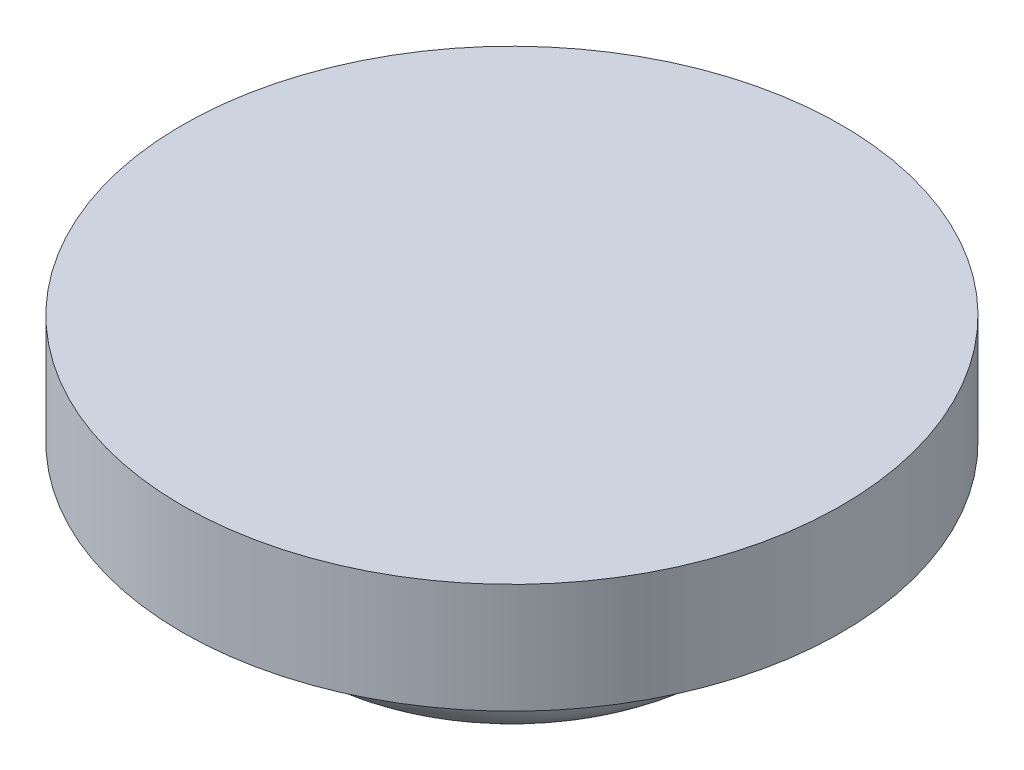
ISO-10303-21;
HEADER;
FILE_DESCRIPTION(('STEP AP214'),'2;1');
FILE_NAME('part.step','',(''),(''),'','','');
FILE_SCHEMA(('AUTOMOTIVE_DESIGN { 1 0 10303 214 1 1 1 1 }'));
ENDSEC;
DATA;
#1=APPLICATION_CONTEXT('core data for automotive mechanical design processes');
#2=APPLICATION_PROTOCOL_DEFINITION('international standard','automotive_design',2000,#1);
#3=PRODUCT_CONTEXT('',#1,'mechanical');
#4=PRODUCT('Part','Part','',(#3));
#5=PRODUCT_RELATED_PRODUCT_CATEGORY('part','',(#4));
#6=PRODUCT_DEFINITION_FORMATION('','',#4);
#7=PRODUCT_DEFINITION_CONTEXT('part definition',#1,'design');
#8=PRODUCT_DEFINITION('design','',#6,#7);
#9=PRODUCT_DEFINITION_SHAPE('','',#8);
#10=(LENGTH_UNIT() NAMED_UNIT(*) SI_UNIT(.MILLI.,.METRE.));
#11=(NAMED_UNIT(*) PLANE_ANGLE_UNIT() SI_UNIT($,.RADIAN.));
#12=(NAMED_UNIT(*) SI_UNIT($,.STERADIAN.) SOLID_ANGLE_UNIT());
#13=UNCERTAINTY_MEASURE_WITH_UNIT(LENGTH_MEASURE(1.E-05),#10,'distance_accuracy_value','');
#14=(GEOMETRIC_REPRESENTATION_CONTEXT(3) GLOBAL_UNCERTAINTY_ASSIGNED_CONTEXT((#13)) GLOBAL_UNIT_ASSIGNED_CONTEXT((#10,
#11,#12)) REPRESENTATION_CONTEXT('',''));
#15=CARTESIAN_POINT('',(0.,0.,0.));
#16=DIRECTION('',(0.,0.,1.));
#17=DIRECTION('',(1.,0.,0.));
#18=AXIS2_PLACEMENT_3D('',#15,#16,#17);
#19=CARTESIAN_POINT('',(0.,5.,0.));
#20=DIRECTION('',(0.,-1.,0.));
#21=DIRECTION('',(0.,0.,-1.));
#22=AXIS2_PLACEMENT_3D('',#19,#20,#21);
#23=CYLINDRICAL_SURFACE('',#22,10.);
#24=CARTESIAN_POINT('',(0.,2.,0.));
#25=DIRECTION('',(0.,1.,0.));
#26=DIRECTION('',(0.,0.,1.));
#27=AXIS2_PLACEMENT_3D('',#24,#25,#26);
#28=CIRCLE('',#27,10.);
#29=CARTESIAN_POINT('',(0.,2.,10.));
#30=VERTEX_POINT('',#29);
#31=EDGE_CURVE('E41',#30,#30,#28,.T.);
#32=ORIENTED_EDGE('',*,*,#31,.T.);
#33=EDGE_LOOP('',(#32));
#34=FACE_BOUND('',#33,.T.);
#35=CARTESIAN_POINT('',(0.,5.,0.));
#36=DIRECTION('',(0.,1.,0.));
#37=DIRECTION('',(0.,0.,1.));
#38=AXIS2_PLACEMENT_3D('',#35,#36,#37);
#39=CIRCLE('',#38,10.);
#40=CARTESIAN_POINT('',(0.,5.,10.));
#41=VERTEX_POINT('',#40);
#42=EDGE_CURVE('E45',#41,#41,#39,.T.);
#43=ORIENTED_EDGE('',*,*,#42,.F.);
#44=EDGE_LOOP('',(#43));
#45=FACE_BOUND('',#44,.T.);
#46=ADVANCED_FACE('F34',(#34,#45),#23,.T.);
#47=CARTESIAN_POINT('',(0.,0.,0.));
#48=DIRECTION('',(0.,1.,0.));
#49=DIRECTION('',(0.,0.,1.));
#50=AXIS2_PLACEMENT_3D('',#47,#48,#49);
#51=PLANE('',#50);
#52=CARTESIAN_POINT('',(0.,0.,0.));
#53=DIRECTION('',(0.,1.,0.));
#54=DIRECTION('',(0.,0.,1.));
#55=AXIS2_PLACEMENT_3D('',#52,#53,#54);
#56=CIRCLE('',#55,8.);
#57=CARTESIAN_POINT('',(0.,0.,8.));
#58=VERTEX_POINT('',#57);
#59=EDGE_CURVE('E11',#58,#58,#56,.F.);
#60=ORIENTED_EDGE('',*,*,#59,.T.);
#61=EDGE_LOOP('',(#60));
#62=FACE_BOUND('',#61,.T.);
#63=ADVANCED_FACE('F75',(#62),#51,.F.);
#64=CARTESIAN_POINT('',(0.,2.,0.));
#65=DIRECTION('',(0.,1.,0.));
#66=DIRECTION('',(0.,0.,1.));
#67=AXIS2_PLACEMENT_3D('',#64,#65,#66);
#68=TOROIDAL_SURFACE('',#67,8.,2.);
#69=ORIENTED_EDGE('',*,*,#59,.F.);
#70=EDGE_LOOP('',(#69));
#71=FACE_BOUND('',#70,.T.);
#72=ORIENTED_EDGE('',*,*,#31,.F.);
#73=EDGE_LOOP('',(#72));
#74=FACE_BOUND('',#73,.T.);
#75=ADVANCED_FACE('F36',(#71,#74),#68,.T.);
#76=CARTESIAN_POINT('',(0.,10.,0.));
#77=DIRECTION('',(0.,-1.,0.));
#78=DIRECTION('',(0.,0.,-1.));
#79=AXIS2_PLACEMENT_3D('',#76,#77,#78);
#80=CYLINDRICAL_SURFACE('',#79,15.);
#81=CARTESIAN_POINT('',(0.,10.,0.));
#82=DIRECTION('',(0.,1.,0.));
#83=DIRECTION('',(0.,0.,1.));
#84=AXIS2_PLACEMENT_3D('',#81,#82,#83);
#85=CIRCLE('',#84,15.);
#86=CARTESIAN_POINT('',(0.,10.,15.));
#87=VERTEX_POINT('',#86);
#88=EDGE_CURVE('E49',#87,#87,#85,.T.);
#89=ORIENTED_EDGE('',*,*,#88,.F.);
#90=EDGE_LOOP('',(#89));
#91=FACE_BOUND('',#90,.T.);
#92=CARTESIAN_POINT('',(0.,5.,0.));
#93=DIRECTION('',(0.,1.,0.));
#94=DIRECTION('',(0.,0.,1.));
#95=AXIS2_PLACEMENT_3D('',#92,#93,#94);
#96=CIRCLE('',#95,15.);
#97=CARTESIAN_POINT('',(0.,5.,15.));
#98=VERTEX_POINT('',#97);
#99=EDGE_CURVE('E52',#98,#98,#96,.T.);
#100=ORIENTED_EDGE('',*,*,#99,.T.);
#101=EDGE_LOOP('',(#100));
#102=FACE_BOUND('',#101,.T.);
#103=ADVANCED_FACE('F60',(#91,#102),#80,.T.);
#104=CARTESIAN_POINT('',(0.,10.,0.));
#105=DIRECTION('',(0.,1.,0.));
#106=DIRECTION('',(0.,0.,1.));
#107=AXIS2_PLACEMENT_3D('',#104,#105,#106);
#108=PLANE('',#107);
#109=ORIENTED_EDGE('',*,*,#88,.T.);
#110=EDGE_LOOP('',(#109));
#111=FACE_BOUND('',#110,.T.);
#112=ADVANCED_FACE('F58',(#111),#108,.T.);
#113=CARTESIAN_POINT('',(0.,5.,0.));
#114=DIRECTION('',(0.,1.,0.));
#115=DIRECTION('',(0.,0.,1.));
#116=AXIS2_PLACEMENT_3D('',#113,#114,#115);
#117=PLANE('',#116);
#118=ORIENTED_EDGE('',*,*,#42,.T.);
#119=EDGE_LOOP('',(#118));
#120=FACE_BOUND('',#119,.T.);
#121=ORIENTED_EDGE('',*,*,#99,.F.);
#122=EDGE_LOOP('',(#121));
#123=FACE_BOUND('',#122,.T.);
#124=ADVANCED_FACE('F66',(#120,#123),#117,.F.);
#125=CLOSED_SHELL('',(#46,#63,#75,#103,#112,#124));
#126=MANIFOLD_SOLID_BREP('B2',#125);
#127=ADVANCED_BREP_SHAPE_REPRESENTATION('',(#18,#126),#14);
#128=SHAPE_DEFINITION_REPRESENTATION(#9,#127);
ENDSEC;
END-ISO-10303-21;
